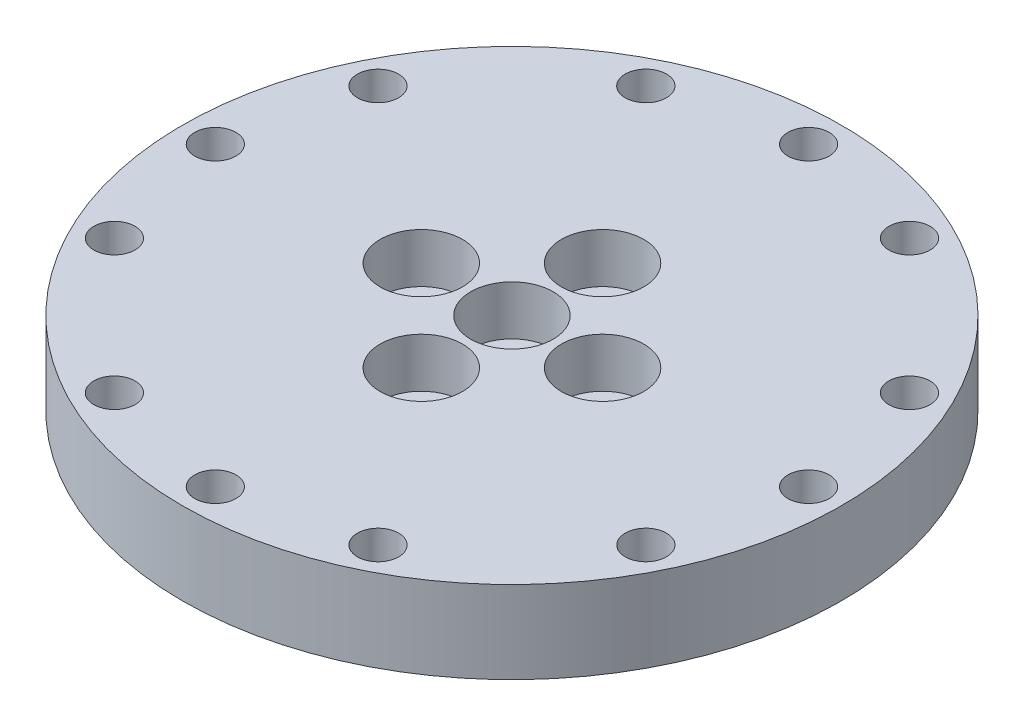
ISO-10303-21;
HEADER;
FILE_DESCRIPTION(('STEP AP214'),'2;1');
FILE_NAME('part.step','',(''),(''),'','','');
FILE_SCHEMA(('AUTOMOTIVE_DESIGN { 1 0 10303 214 1 1 1 1 }'));
ENDSEC;
DATA;
#1=APPLICATION_CONTEXT('core data for automotive mechanical design processes');
#2=APPLICATION_PROTOCOL_DEFINITION('international standard','automotive_design',2000,#1);
#3=PRODUCT_CONTEXT('',#1,'mechanical');
#4=PRODUCT('Part','Part','',(#3));
#5=PRODUCT_RELATED_PRODUCT_CATEGORY('part','',(#4));
#6=PRODUCT_DEFINITION_FORMATION('','',#4);
#7=PRODUCT_DEFINITION_CONTEXT('part definition',#1,'design');
#8=PRODUCT_DEFINITION('design','',#6,#7);
#9=PRODUCT_DEFINITION_SHAPE('','',#8);
#10=(LENGTH_UNIT() NAMED_UNIT(*) SI_UNIT(.MILLI.,.METRE.));
#11=(NAMED_UNIT(*) PLANE_ANGLE_UNIT() SI_UNIT($,.RADIAN.));
#12=(NAMED_UNIT(*) SI_UNIT($,.STERADIAN.) SOLID_ANGLE_UNIT());
#13=UNCERTAINTY_MEASURE_WITH_UNIT(LENGTH_MEASURE(1.E-05),#10,'distance_accuracy_value','');
#14=(GEOMETRIC_REPRESENTATION_CONTEXT(3) GLOBAL_UNCERTAINTY_ASSIGNED_CONTEXT((#13)) GLOBAL_UNIT_ASSIGNED_CONTEXT((#10,
#11,#12)) REPRESENTATION_CONTEXT('',''));
#15=CARTESIAN_POINT('',(0.,0.,0.));
#16=DIRECTION('',(0.,0.,1.));
#17=DIRECTION('',(1.,0.,0.));
#18=AXIS2_PLACEMENT_3D('',#15,#16,#17);
#19=CARTESIAN_POINT('',(0.,19.,0.));
#20=DIRECTION('',(0.,-1.,0.));
#21=DIRECTION('',(0.,0.,-1.));
#22=AXIS2_PLACEMENT_3D('',#19,#20,#21);
#23=CYLINDRICAL_SURFACE('',#22,3.05);
#24=CARTESIAN_POINT('',(0.,9.,0.));
#25=DIRECTION('',(0.,1.,0.));
#26=DIRECTION('',(0.,0.,1.));
#27=AXIS2_PLACEMENT_3D('',#24,#25,#26);
#28=CIRCLE('',#27,3.05);
#29=CARTESIAN_POINT('',(0.,9.,3.05));
#30=VERTEX_POINT('',#29);
#31=EDGE_CURVE('E62',#30,#30,#28,.T.);
#32=ORIENTED_EDGE('',*,*,#31,.F.);
#33=EDGE_LOOP('',(#32));
#34=FACE_BOUND('',#33,.T.);
#35=CARTESIAN_POINT('',(0.,13.,0.));
#36=DIRECTION('',(0.,1.,0.));
#37=DIRECTION('',(0.,0.,1.));
#38=AXIS2_PLACEMENT_3D('',#35,#36,#37);
#39=CIRCLE('',#38,3.05);
#40=CARTESIAN_POINT('',(0.,13.,3.05));
#41=VERTEX_POINT('',#40);
#42=EDGE_CURVE('E152',#41,#41,#39,.F.);
#43=ORIENTED_EDGE('',*,*,#42,.F.);
#44=EDGE_LOOP('',(#43));
#45=FACE_BOUND('',#44,.T.);
#46=ADVANCED_FACE('F39',(#34,#45),#23,.F.);
#47=CARTESIAN_POINT('',(-11.,19.,0.));
#48=DIRECTION('',(0.,-1.,0.));
#49=DIRECTION('',(0.,0.,-1.));
#50=AXIS2_PLACEMENT_3D('',#47,#48,#49);
#51=CYLINDRICAL_SURFACE('',#50,3.05);
#52=CARTESIAN_POINT('',(-11.,9.,0.));
#53=DIRECTION('',(0.,1.,0.));
#54=DIRECTION('',(0.,0.,1.));
#55=AXIS2_PLACEMENT_3D('',#52,#53,#54);
#56=CIRCLE('',#55,3.05);
#57=CARTESIAN_POINT('',(-11.,9.,3.05));
#58=VERTEX_POINT('',#57);
#59=EDGE_CURVE('E68',#58,#58,#56,.T.);
#60=ORIENTED_EDGE('',*,*,#59,.F.);
#61=EDGE_LOOP('',(#60));
#62=FACE_BOUND('',#61,.T.);
#63=CARTESIAN_POINT('',(-11.,13.,0.));
#64=DIRECTION('',(0.,1.,0.));
#65=DIRECTION('',(0.,0.,1.));
#66=AXIS2_PLACEMENT_3D('',#63,#64,#65);
#67=CIRCLE('',#66,3.05);
#68=CARTESIAN_POINT('',(-11.,13.,3.05));
#69=VERTEX_POINT('',#68);
#70=EDGE_CURVE('E163',#69,#69,#67,.F.);
#71=ORIENTED_EDGE('',*,*,#70,.F.);
#72=EDGE_LOOP('',(#71));
#73=FACE_BOUND('',#72,.T.);
#74=ADVANCED_FACE('F220',(#62,#73),#51,.F.);
#75=CARTESIAN_POINT('',(0.,19.,11.));
#76=DIRECTION('',(0.,-1.,0.));
#77=DIRECTION('',(0.,0.,-1.));
#78=AXIS2_PLACEMENT_3D('',#75,#76,#77);
#79=CYLINDRICAL_SURFACE('',#78,3.05);
#80=CARTESIAN_POINT('',(0.,9.,11.));
#81=DIRECTION('',(0.,1.,0.));
#82=DIRECTION('',(0.,0.,1.));
#83=AXIS2_PLACEMENT_3D('',#80,#81,#82);
#84=CIRCLE('',#83,3.05);
#85=CARTESIAN_POINT('',(0.,9.,14.05));
#86=VERTEX_POINT('',#85);
#87=EDGE_CURVE('E69',#86,#86,#84,.T.);
#88=ORIENTED_EDGE('',*,*,#87,.F.);
#89=EDGE_LOOP('',(#88));
#90=FACE_BOUND('',#89,.T.);
#91=CARTESIAN_POINT('',(0.,13.,11.));
#92=DIRECTION('',(0.,1.,0.));
#93=DIRECTION('',(0.,0.,1.));
#94=AXIS2_PLACEMENT_3D('',#91,#92,#93);
#95=CIRCLE('',#94,3.05);
#96=CARTESIAN_POINT('',(0.,13.,14.05));
#97=VERTEX_POINT('',#96);
#98=EDGE_CURVE('E171',#97,#97,#95,.F.);
#99=ORIENTED_EDGE('',*,*,#98,.F.);
#100=EDGE_LOOP('',(#99));
#101=FACE_BOUND('',#100,.T.);
#102=ADVANCED_FACE('F211',(#90,#101),#79,.F.);
#103=CARTESIAN_POINT('',(11.,19.,0.));
#104=DIRECTION('',(0.,-1.,0.));
#105=DIRECTION('',(0.,0.,-1.));
#106=AXIS2_PLACEMENT_3D('',#103,#104,#105);
#107=CYLINDRICAL_SURFACE('',#106,3.05);
#108=CARTESIAN_POINT('',(11.,9.,0.));
#109=DIRECTION('',(0.,1.,0.));
#110=DIRECTION('',(0.,0.,1.));
#111=AXIS2_PLACEMENT_3D('',#108,#109,#110);
#112=CIRCLE('',#111,3.05);
#113=CARTESIAN_POINT('',(11.,9.,3.05));
#114=VERTEX_POINT('',#113);
#115=EDGE_CURVE('E75',#114,#114,#112,.T.);
#116=ORIENTED_EDGE('',*,*,#115,.F.);
#117=EDGE_LOOP('',(#116));
#118=FACE_BOUND('',#117,.T.);
#119=CARTESIAN_POINT('',(11.,13.,0.));
#120=DIRECTION('',(0.,1.,0.));
#121=DIRECTION('',(0.,0.,1.));
#122=AXIS2_PLACEMENT_3D('',#119,#120,#121);
#123=CIRCLE('',#122,3.05);
#124=CARTESIAN_POINT('',(11.,13.,3.05));
#125=VERTEX_POINT('',#124);
#126=EDGE_CURVE('E181',#125,#125,#123,.F.);
#127=ORIENTED_EDGE('',*,*,#126,.F.);
#128=EDGE_LOOP('',(#127));
#129=FACE_BOUND('',#128,.T.);
#130=ADVANCED_FACE('F205',(#118,#129),#107,.F.);
#131=CARTESIAN_POINT('',(0.,19.,-11.));
#132=DIRECTION('',(0.,-1.,0.));
#133=DIRECTION('',(0.,0.,-1.));
#134=AXIS2_PLACEMENT_3D('',#131,#132,#133);
#135=CYLINDRICAL_SURFACE('',#134,3.05);
#136=CARTESIAN_POINT('',(0.,9.,-11.));
#137=DIRECTION('',(0.,1.,0.));
#138=DIRECTION('',(0.,0.,1.));
#139=AXIS2_PLACEMENT_3D('',#136,#137,#138);
#140=CIRCLE('',#139,3.05);
#141=CARTESIAN_POINT('',(0.,9.,-7.95));
#142=VERTEX_POINT('',#141);
#143=EDGE_CURVE('E73',#142,#142,#140,.T.);
#144=ORIENTED_EDGE('',*,*,#143,.F.);
#145=EDGE_LOOP('',(#144));
#146=FACE_BOUND('',#145,.T.);
#147=CARTESIAN_POINT('',(0.,13.,-11.));
#148=DIRECTION('',(0.,1.,0.));
#149=DIRECTION('',(0.,0.,1.));
#150=AXIS2_PLACEMENT_3D('',#147,#148,#149);
#151=CIRCLE('',#150,3.05);
#152=CARTESIAN_POINT('',(0.,13.,-7.95));
#153=VERTEX_POINT('',#152);
#154=EDGE_CURVE('E188',#153,#153,#151,.F.);
#155=ORIENTED_EDGE('',*,*,#154,.F.);
#156=EDGE_LOOP('',(#155));
#157=FACE_BOUND('',#156,.T.);
#158=ADVANCED_FACE('F200',(#146,#157),#135,.F.);
#159=CARTESIAN_POINT('',(0.,0.,0.));
#160=DIRECTION('',(0.,1.,0.));
#161=DIRECTION('',(0.,0.,1.));
#162=AXIS2_PLACEMENT_3D('',#159,#160,#161);
#163=PLANE('',#162);
#164=CARTESIAN_POINT('',(0.,0.,0.));
#165=DIRECTION('',(0.,1.,0.));
#166=DIRECTION('',(0.,0.,1.));
#167=AXIS2_PLACEMENT_3D('',#164,#165,#166);
#168=CIRCLE('',#167,21.5);
#169=CARTESIAN_POINT('',(0.,0.,21.5));
#170=VERTEX_POINT('',#169);
#171=EDGE_CURVE('E43',#170,#170,#168,.T.);
#172=ORIENTED_EDGE('',*,*,#171,.F.);
#173=EDGE_LOOP('',(#172));
#174=FACE_BOUND('',#173,.T.);
#175=CARTESIAN_POINT('',(0.,0.,0.));
#176=DIRECTION('',(0.,1.,0.));
#177=DIRECTION('',(0.,0.,1.));
#178=AXIS2_PLACEMENT_3D('',#175,#176,#177);
#179=CIRCLE('',#178,17.5);
#180=CARTESIAN_POINT('',(0.,0.,17.5));
#181=VERTEX_POINT('',#180);
#182=EDGE_CURVE('E49',#181,#181,#179,.T.);
#183=ORIENTED_EDGE('',*,*,#182,.T.);
#184=EDGE_LOOP('',(#183));
#185=FACE_BOUND('',#184,.T.);
#186=ADVANCED_FACE('F203',(#174,#185),#163,.F.);
#187=CARTESIAN_POINT('',(0.,9.,0.));
#188=DIRECTION('',(0.,-1.,0.));
#189=DIRECTION('',(0.,0.,-1.));
#190=AXIS2_PLACEMENT_3D('',#187,#188,#189);
#191=CYLINDRICAL_SURFACE('',#190,21.5);
#192=CARTESIAN_POINT('',(0.,9.,0.));
#193=DIRECTION('',(0.,1.,0.));
#194=DIRECTION('',(0.,0.,1.));
#195=AXIS2_PLACEMENT_3D('',#192,#193,#194);
#196=CIRCLE('',#195,21.5);
#197=CARTESIAN_POINT('',(0.,9.,21.5));
#198=VERTEX_POINT('',#197);
#199=EDGE_CURVE('E10',#198,#198,#196,.T.);
#200=ORIENTED_EDGE('',*,*,#199,.F.);
#201=EDGE_LOOP('',(#200));
#202=FACE_BOUND('',#201,.T.);
#203=ORIENTED_EDGE('',*,*,#171,.T.);
#204=EDGE_LOOP('',(#203));
#205=FACE_BOUND('',#204,.T.);
#206=ADVANCED_FACE('F41',(#202,#205),#191,.T.);
#207=CARTESIAN_POINT('',(0.,9.,0.));
#208=DIRECTION('',(0.,-1.,0.));
#209=DIRECTION('',(0.,0.,-1.));
#210=AXIS2_PLACEMENT_3D('',#207,#208,#209);
#211=CYLINDRICAL_SURFACE('',#210,17.5);
#212=CARTESIAN_POINT('',(0.,9.,0.));
#213=DIRECTION('',(0.,1.,0.));
#214=DIRECTION('',(0.,0.,1.));
#215=AXIS2_PLACEMENT_3D('',#212,#213,#214);
#216=CIRCLE('',#215,17.5);
#217=CARTESIAN_POINT('',(0.,9.,17.5));
#218=VERTEX_POINT('',#217);
#219=EDGE_CURVE('E53',#218,#218,#216,.T.);
#220=ORIENTED_EDGE('',*,*,#219,.T.);
#221=EDGE_LOOP('',(#220));
#222=FACE_BOUND('',#221,.T.);
#223=ORIENTED_EDGE('',*,*,#182,.F.);
#224=EDGE_LOOP('',(#223));
#225=FACE_BOUND('',#224,.T.);
#226=ADVANCED_FACE('F244',(#222,#225),#211,.F.);
#227=CARTESIAN_POINT('',(0.,9.,0.));
#228=DIRECTION('',(0.,1.,0.));
#229=DIRECTION('',(0.,0.,1.));
#230=AXIS2_PLACEMENT_3D('',#227,#228,#229);
#231=PLANE('',#230);
#232=ORIENTED_EDGE('',*,*,#143,.T.);
#233=EDGE_LOOP('',(#232));
#234=FACE_BOUND('',#233,.T.);
#235=ORIENTED_EDGE('',*,*,#115,.T.);
#236=EDGE_LOOP('',(#235));
#237=FACE_BOUND('',#236,.T.);
#238=ORIENTED_EDGE('',*,*,#87,.T.);
#239=EDGE_LOOP('',(#238));
#240=FACE_BOUND('',#239,.T.);
#241=ORIENTED_EDGE('',*,*,#59,.T.);
#242=EDGE_LOOP('',(#241));
#243=FACE_BOUND('',#242,.T.);
#244=ORIENTED_EDGE('',*,*,#31,.T.);
#245=EDGE_LOOP('',(#244));
#246=FACE_BOUND('',#245,.T.);
#247=ORIENTED_EDGE('',*,*,#219,.F.);
#248=EDGE_LOOP('',(#247));
#249=FACE_BOUND('',#248,.T.);
#250=ADVANCED_FACE('F231',(#234,#237,#240,#243,#246,#249),#231,.F.);
#251=CARTESIAN_POINT('',(0.,19.,0.));
#252=DIRECTION('',(0.,1.,0.));
#253=DIRECTION('',(0.,0.,1.));
#254=AXIS2_PLACEMENT_3D('',#251,#252,#253);
#255=PLANE('',#254);
#256=CARTESIAN_POINT('',(0.,19.,-11.));
#257=DIRECTION('',(0.,1.,0.));
#258=DIRECTION('',(0.,0.,1.));
#259=AXIS2_PLACEMENT_3D('',#256,#257,#258);
#260=CIRCLE('',#259,5.);
#261=CARTESIAN_POINT('',(0.,19.,-6.));
#262=VERTEX_POINT('',#261);
#263=EDGE_CURVE('E169',#262,#262,#260,.T.);
#264=ORIENTED_EDGE('',*,*,#263,.F.);
#265=EDGE_LOOP('',(#264));
#266=FACE_BOUND('',#265,.T.);
#267=CARTESIAN_POINT('',(0.,19.,11.));
#268=DIRECTION('',(0.,1.,0.));
#269=DIRECTION('',(0.,0.,1.));
#270=AXIS2_PLACEMENT_3D('',#267,#268,#269);
#271=CIRCLE('',#270,5.);
#272=CARTESIAN_POINT('',(0.,19.,16.));
#273=VERTEX_POINT('',#272);
#274=EDGE_CURVE('E172',#273,#273,#271,.T.);
#275=ORIENTED_EDGE('',*,*,#274,.F.);
#276=EDGE_LOOP('',(#275));
#277=FACE_BOUND('',#276,.T.);
#278=CARTESIAN_POINT('',(11.,19.,0.));
#279=DIRECTION('',(0.,1.,0.));
#280=DIRECTION('',(0.,0.,1.));
#281=AXIS2_PLACEMENT_3D('',#278,#279,#280);
#282=CIRCLE('',#281,5.);
#283=CARTESIAN_POINT('',(11.,19.,5.));
#284=VERTEX_POINT('',#283);
#285=EDGE_CURVE('E176',#284,#284,#282,.T.);
#286=ORIENTED_EDGE('',*,*,#285,.F.);
#287=EDGE_LOOP('',(#286));
#288=FACE_BOUND('',#287,.T.);
#289=CARTESIAN_POINT('',(0.,19.,0.));
#290=DIRECTION('',(0.,1.,0.));
#291=DIRECTION('',(0.,0.,1.));
#292=AXIS2_PLACEMENT_3D('',#289,#290,#291);
#293=CIRCLE('',#292,5.);
#294=CARTESIAN_POINT('',(0.,19.,5.));
#295=VERTEX_POINT('',#294);
#296=EDGE_CURVE('E151',#295,#295,#293,.T.);
#297=ORIENTED_EDGE('',*,*,#296,.F.);
#298=EDGE_LOOP('',(#297));
#299=FACE_BOUND('',#298,.T.);
#300=CARTESIAN_POINT('',(-11.,19.,0.));
#301=DIRECTION('',(0.,1.,0.));
#302=DIRECTION('',(0.,0.,1.));
#303=AXIS2_PLACEMENT_3D('',#300,#301,#302);
#304=CIRCLE('',#303,5.);
#305=CARTESIAN_POINT('',(-11.,19.,5.));
#306=VERTEX_POINT('',#305);
#307=EDGE_CURVE('E157',#306,#306,#304,.T.);
#308=ORIENTED_EDGE('',*,*,#307,.F.);
#309=EDGE_LOOP('',(#308));
#310=FACE_BOUND('',#309,.T.);
#311=CARTESIAN_POINT('',(32.2510830549863,19.,-15.9958632708703));
#312=DIRECTION('',(0.,1.,0.));
#313=DIRECTION('',(0.,0.,1.));
#314=AXIS2_PLACEMENT_3D('',#311,#312,#313);
#315=CIRCLE('',#314,2.50283122182016);
#316=CARTESIAN_POINT('',(32.2510830549863,19.,-13.4930320490502));
#317=VERTEX_POINT('',#316);
#318=EDGE_CURVE('E138',#317,#317,#315,.T.);
#319=ORIENTED_EDGE('',*,*,#318,.F.);
#320=EDGE_LOOP('',(#319));
#321=FACE_BOUND('',#320,.T.);
#322=CARTESIAN_POINT('',(16.,19.,32.25));
#323=DIRECTION('',(0.,1.,0.));
#324=DIRECTION('',(0.,0.,1.));
#325=AXIS2_PLACEMENT_3D('',#322,#323,#324);
#326=CIRCLE('',#325,2.5);
#327=CARTESIAN_POINT('',(16.,19.,34.75));
#328=VERTEX_POINT('',#327);
#329=EDGE_CURVE('E124',#328,#328,#326,.T.);
#330=ORIENTED_EDGE('',*,*,#329,.F.);
#331=EDGE_LOOP('',(#330));
#332=FACE_BOUND('',#331,.T.);
#333=CARTESIAN_POINT('',(-32.2510830549863,19.,15.9958632708703));
#334=DIRECTION('',(0.,1.,0.));
#335=DIRECTION('',(0.,0.,1.));
#336=AXIS2_PLACEMENT_3D('',#333,#334,#335);
#337=CIRCLE('',#336,2.49952999559767);
#338=CARTESIAN_POINT('',(-32.2510830549863,19.,18.495393266468));
#339=VERTEX_POINT('',#338);
#340=EDGE_CURVE('E115',#339,#339,#337,.T.);
#341=ORIENTED_EDGE('',*,*,#340,.F.);
#342=EDGE_LOOP('',(#341));
#343=FACE_BOUND('',#342,.T.);
#344=CARTESIAN_POINT('',(-36.,19.,0.));
#345=DIRECTION('',(0.,1.,0.));
#346=DIRECTION('',(0.,0.,1.));
#347=AXIS2_PLACEMENT_3D('',#344,#345,#346);
#348=CIRCLE('',#347,2.5);
#349=CARTESIAN_POINT('',(-36.,19.,2.5));
#350=VERTEX_POINT('',#349);
#351=EDGE_CURVE('E99',#350,#350,#348,.T.);
#352=ORIENTED_EDGE('',*,*,#351,.F.);
#353=EDGE_LOOP('',(#352));
#354=FACE_BOUND('',#353,.T.);
#355=CARTESIAN_POINT('',(-16.,19.,-32.2535851567538));
#356=DIRECTION('',(0.,1.,0.));
#357=DIRECTION('',(0.,0.,1.));
#358=AXIS2_PLACEMENT_3D('',#355,#356,#357);
#359=CIRCLE('',#358,2.50358515675376);
#360=CARTESIAN_POINT('',(-16.,19.,-29.75));
#361=VERTEX_POINT('',#360);
#362=EDGE_CURVE('E86',#361,#361,#359,.T.);
#363=ORIENTED_EDGE('',*,*,#362,.F.);
#364=EDGE_LOOP('',(#363));
#365=FACE_BOUND('',#364,.T.);
#366=CARTESIAN_POINT('',(0.,19.,-36.));
#367=DIRECTION('',(0.,1.,0.));
#368=DIRECTION('',(0.,0.,1.));
#369=AXIS2_PLACEMENT_3D('',#366,#367,#368);
#370=CIRCLE('',#369,2.5);
#371=CARTESIAN_POINT('',(0.,19.,-33.5));
#372=VERTEX_POINT('',#371);
#373=EDGE_CURVE('E80',#372,#372,#370,.T.);
#374=ORIENTED_EDGE('',*,*,#373,.F.);
#375=EDGE_LOOP('',(#374));
#376=FACE_BOUND('',#375,.T.);
#377=CARTESIAN_POINT('',(0.,19.,0.));
#378=DIRECTION('',(0.,1.,0.));
#379=DIRECTION('',(0.,0.,1.));
#380=AXIS2_PLACEMENT_3D('',#377,#378,#379);
#381=CIRCLE('',#380,40.);
#382=CARTESIAN_POINT('',(0.,19.,40.));
#383=VERTEX_POINT('',#382);
#384=EDGE_CURVE('E60',#383,#383,#381,.T.);
#385=ORIENTED_EDGE('',*,*,#384,.T.);
#386=EDGE_LOOP('',(#385));
#387=FACE_BOUND('',#386,.T.);
#388=CARTESIAN_POINT('',(-16.,19.,32.25));
#389=DIRECTION('',(0.,1.,0.));
#390=DIRECTION('',(0.,0.,1.));
#391=AXIS2_PLACEMENT_3D('',#388,#389,#390);
#392=CIRCLE('',#391,2.5);
#393=CARTESIAN_POINT('',(-16.,19.,34.75));
#394=VERTEX_POINT('',#393);
#395=EDGE_CURVE('E85',#394,#394,#392,.T.);
#396=ORIENTED_EDGE('',*,*,#395,.F.);
#397=EDGE_LOOP('',(#396));
#398=FACE_BOUND('',#397,.T.);
#399=CARTESIAN_POINT('',(16.,19.,-32.2535851567538));
#400=DIRECTION('',(0.,1.,0.));
#401=DIRECTION('',(0.,0.,1.));
#402=AXIS2_PLACEMENT_3D('',#399,#400,#401);
#403=CIRCLE('',#402,2.50358515675376);
#404=CARTESIAN_POINT('',(16.,19.,-29.75));
#405=VERTEX_POINT('',#404);
#406=EDGE_CURVE('E94',#405,#405,#403,.T.);
#407=ORIENTED_EDGE('',*,*,#406,.F.);
#408=EDGE_LOOP('',(#407));
#409=FACE_BOUND('',#408,.T.);
#410=CARTESIAN_POINT('',(-32.2510830549863,19.,-15.9958632708703));
#411=DIRECTION('',(0.,1.,0.));
#412=DIRECTION('',(0.,0.,1.));
#413=AXIS2_PLACEMENT_3D('',#410,#411,#412);
#414=CIRCLE('',#413,2.49692504726813);
#415=CARTESIAN_POINT('',(-32.2510830549863,19.,-13.4989382236022));
#416=VERTEX_POINT('',#415);
#417=EDGE_CURVE('E106',#416,#416,#414,.T.);
#418=ORIENTED_EDGE('',*,*,#417,.F.);
#419=EDGE_LOOP('',(#418));
#420=FACE_BOUND('',#419,.T.);
#421=CARTESIAN_POINT('',(0.,19.,36.));
#422=DIRECTION('',(0.,1.,0.));
#423=DIRECTION('',(0.,0.,1.));
#424=AXIS2_PLACEMENT_3D('',#421,#422,#423);
#425=CIRCLE('',#424,2.5);
#426=CARTESIAN_POINT('',(0.,19.,38.5));
#427=VERTEX_POINT('',#426);
#428=EDGE_CURVE('E120',#427,#427,#425,.T.);
#429=ORIENTED_EDGE('',*,*,#428,.F.);
#430=EDGE_LOOP('',(#429));
#431=FACE_BOUND('',#430,.T.);
#432=CARTESIAN_POINT('',(36.,19.,0.));
#433=DIRECTION('',(0.,1.,0.));
#434=DIRECTION('',(0.,0.,1.));
#435=AXIS2_PLACEMENT_3D('',#432,#433,#434);
#436=CIRCLE('',#435,2.49999999999999);
#437=CARTESIAN_POINT('',(36.,19.,2.49999999999999));
#438=VERTEX_POINT('',#437);
#439=EDGE_CURVE('E128',#438,#438,#436,.T.);
#440=ORIENTED_EDGE('',*,*,#439,.F.);
#441=EDGE_LOOP('',(#440));
#442=FACE_BOUND('',#441,.T.);
#443=CARTESIAN_POINT('',(32.2510830549863,19.,15.9958632708703));
#444=DIRECTION('',(0.,1.,0.));
#445=DIRECTION('',(0.,0.,1.));
#446=AXIS2_PLACEMENT_3D('',#443,#444,#445);
#447=CIRCLE('',#446,2.5);
#448=CARTESIAN_POINT('',(32.2510830549863,19.,18.4958632708703));
#449=VERTEX_POINT('',#448);
#450=EDGE_CURVE('E142',#449,#449,#447,.T.);
#451=ORIENTED_EDGE('',*,*,#450,.F.);
#452=EDGE_LOOP('',(#451));
#453=FACE_BOUND('',#452,.T.);
#454=ADVANCED_FACE('F228',(#266,#277,#288,#299,#310,#321,#332,#343,#354,#365,#376,#387,#398,
#409,#420,#431,#442,#453),#255,.T.);
#455=ORIENTED_EDGE('',*,*,#199,.T.);
#456=EDGE_LOOP('',(#455));
#457=FACE_BOUND('',#456,.T.);
#458=CARTESIAN_POINT('',(0.,9.,0.));
#459=DIRECTION('',(0.,1.,0.));
#460=DIRECTION('',(0.,0.,1.));
#461=AXIS2_PLACEMENT_3D('',#458,#459,#460);
#462=CIRCLE('',#461,40.);
#463=CARTESIAN_POINT('',(0.,9.,40.));
#464=VERTEX_POINT('',#463);
#465=EDGE_CURVE('E59',#464,#464,#462,.T.);
#466=ORIENTED_EDGE('',*,*,#465,.F.);
#467=EDGE_LOOP('',(#466));
#468=FACE_BOUND('',#467,.T.);
#469=CARTESIAN_POINT('',(0.,9.,-36.));
#470=DIRECTION('',(0.,1.,0.));
#471=DIRECTION('',(0.,0.,1.));
#472=AXIS2_PLACEMENT_3D('',#469,#470,#471);
#473=CIRCLE('',#472,2.5);
#474=CARTESIAN_POINT('',(0.,9.,-33.5));
#475=VERTEX_POINT('',#474);
#476=EDGE_CURVE('E76',#475,#475,#473,.T.);
#477=ORIENTED_EDGE('',*,*,#476,.T.);
#478=EDGE_LOOP('',(#477));
#479=FACE_BOUND('',#478,.T.);
#480=CARTESIAN_POINT('',(-16.,9.,32.25));
#481=DIRECTION('',(0.,1.,0.));
#482=DIRECTION('',(0.,0.,1.));
#483=AXIS2_PLACEMENT_3D('',#480,#481,#482);
#484=CIRCLE('',#483,2.5);
#485=CARTESIAN_POINT('',(-16.,9.,34.75));
#486=VERTEX_POINT('',#485);
#487=EDGE_CURVE('E82',#486,#486,#484,.T.);
#488=ORIENTED_EDGE('',*,*,#487,.T.);
#489=EDGE_LOOP('',(#488));
#490=FACE_BOUND('',#489,.T.);
#491=CARTESIAN_POINT('',(-16.,9.,-32.2535851567538));
#492=DIRECTION('',(0.,1.,0.));
#493=DIRECTION('',(0.,0.,1.));
#494=AXIS2_PLACEMENT_3D('',#491,#492,#493);
#495=CIRCLE('',#494,2.50358515675376);
#496=CARTESIAN_POINT('',(-16.,9.,-29.75));
#497=VERTEX_POINT('',#496);
#498=EDGE_CURVE('E93',#497,#497,#495,.T.);
#499=ORIENTED_EDGE('',*,*,#498,.T.);
#500=EDGE_LOOP('',(#499));
#501=FACE_BOUND('',#500,.T.);
#502=CARTESIAN_POINT('',(16.,9.,-32.2535851567538));
#503=DIRECTION('',(0.,1.,0.));
#504=DIRECTION('',(0.,0.,1.));
#505=AXIS2_PLACEMENT_3D('',#502,#503,#504);
#506=CIRCLE('',#505,2.50358515675376);
#507=CARTESIAN_POINT('',(16.,9.,-29.75));
#508=VERTEX_POINT('',#507);
#509=EDGE_CURVE('E100',#508,#508,#506,.T.);
#510=ORIENTED_EDGE('',*,*,#509,.T.);
#511=EDGE_LOOP('',(#510));
#512=FACE_BOUND('',#511,.T.);
#513=CARTESIAN_POINT('',(-36.,9.,0.));
#514=DIRECTION('',(0.,1.,0.));
#515=DIRECTION('',(0.,0.,1.));
#516=AXIS2_PLACEMENT_3D('',#513,#514,#515);
#517=CIRCLE('',#516,2.5);
#518=CARTESIAN_POINT('',(-36.,9.,2.5));
#519=VERTEX_POINT('',#518);
#520=EDGE_CURVE('E103',#519,#519,#517,.T.);
#521=ORIENTED_EDGE('',*,*,#520,.T.);
#522=EDGE_LOOP('',(#521));
#523=FACE_BOUND('',#522,.T.);
#524=CARTESIAN_POINT('',(-32.2510830549863,9.,-15.9958632708703));
#525=DIRECTION('',(0.,1.,0.));
#526=DIRECTION('',(0.,0.,1.));
#527=AXIS2_PLACEMENT_3D('',#524,#525,#526);
#528=CIRCLE('',#527,2.49692504726813);
#529=CARTESIAN_POINT('',(-32.2510830549863,9.,-13.4989382236022));
#530=VERTEX_POINT('',#529);
#531=EDGE_CURVE('E108',#530,#530,#528,.T.);
#532=ORIENTED_EDGE('',*,*,#531,.T.);
#533=EDGE_LOOP('',(#532));
#534=FACE_BOUND('',#533,.T.);
#535=CARTESIAN_POINT('',(-32.2510830549863,9.,15.9958632708703));
#536=DIRECTION('',(0.,1.,0.));
#537=DIRECTION('',(0.,0.,1.));
#538=AXIS2_PLACEMENT_3D('',#535,#536,#537);
#539=CIRCLE('',#538,2.49952999559767);
#540=CARTESIAN_POINT('',(-32.2510830549863,9.,18.495393266468));
#541=VERTEX_POINT('',#540);
#542=EDGE_CURVE('E113',#541,#541,#539,.T.);
#543=ORIENTED_EDGE('',*,*,#542,.T.);
#544=EDGE_LOOP('',(#543));
#545=FACE_BOUND('',#544,.T.);
#546=CARTESIAN_POINT('',(0.,9.,36.));
#547=DIRECTION('',(0.,1.,0.));
#548=DIRECTION('',(0.,0.,1.));
#549=AXIS2_PLACEMENT_3D('',#546,#547,#548);
#550=CIRCLE('',#549,2.5);
#551=CARTESIAN_POINT('',(0.,9.,38.5));
#552=VERTEX_POINT('',#551);
#553=EDGE_CURVE('E123',#552,#552,#550,.T.);
#554=ORIENTED_EDGE('',*,*,#553,.T.);
#555=EDGE_LOOP('',(#554));
#556=FACE_BOUND('',#555,.T.);
#557=CARTESIAN_POINT('',(16.,9.,32.25));
#558=DIRECTION('',(0.,1.,0.));
#559=DIRECTION('',(0.,0.,1.));
#560=AXIS2_PLACEMENT_3D('',#557,#558,#559);
#561=CIRCLE('',#560,2.5);
#562=CARTESIAN_POINT('',(16.,9.,34.75));
#563=VERTEX_POINT('',#562);
#564=EDGE_CURVE('E130',#563,#563,#561,.T.);
#565=ORIENTED_EDGE('',*,*,#564,.T.);
#566=EDGE_LOOP('',(#565));
#567=FACE_BOUND('',#566,.T.);
#568=CARTESIAN_POINT('',(36.,9.,0.));
#569=DIRECTION('',(0.,1.,0.));
#570=DIRECTION('',(0.,0.,1.));
#571=AXIS2_PLACEMENT_3D('',#568,#569,#570);
#572=CIRCLE('',#571,2.49999999999999);
#573=CARTESIAN_POINT('',(36.,9.,2.49999999999999));
#574=VERTEX_POINT('',#573);
#575=EDGE_CURVE('E135',#574,#574,#572,.T.);
#576=ORIENTED_EDGE('',*,*,#575,.T.);
#577=EDGE_LOOP('',(#576));
#578=FACE_BOUND('',#577,.T.);
#579=CARTESIAN_POINT('',(32.2510830549863,9.,-15.9958632708703));
#580=DIRECTION('',(0.,1.,0.));
#581=DIRECTION('',(0.,0.,1.));
#582=AXIS2_PLACEMENT_3D('',#579,#580,#581);
#583=CIRCLE('',#582,2.50283122182016);
#584=CARTESIAN_POINT('',(32.2510830549863,9.,-13.4930320490502));
#585=VERTEX_POINT('',#584);
#586=EDGE_CURVE('E139',#585,#585,#583,.T.);
#587=ORIENTED_EDGE('',*,*,#586,.T.);
#588=EDGE_LOOP('',(#587));
#589=FACE_BOUND('',#588,.T.);
#590=CARTESIAN_POINT('',(32.2510830549863,9.,15.9958632708703));
#591=DIRECTION('',(0.,1.,0.));
#592=DIRECTION('',(0.,0.,1.));
#593=AXIS2_PLACEMENT_3D('',#590,#591,#592);
#594=CIRCLE('',#593,2.5);
#595=CARTESIAN_POINT('',(32.2510830549863,9.,18.4958632708703));
#596=VERTEX_POINT('',#595);
#597=EDGE_CURVE('E144',#596,#596,#594,.T.);
#598=ORIENTED_EDGE('',*,*,#597,.T.);
#599=EDGE_LOOP('',(#598));
#600=FACE_BOUND('',#599,.T.);
#601=ADVANCED_FACE('F235',(#457,#468,#479,#490,#501,#512,#523,#534,#545,#556,#567,#578,#589,
#600),#231,.F.);
#602=CARTESIAN_POINT('',(0.,19.,0.));
#603=DIRECTION('',(0.,-1.,0.));
#604=DIRECTION('',(0.,0.,-1.));
#605=AXIS2_PLACEMENT_3D('',#602,#603,#604);
#606=CYLINDRICAL_SURFACE('',#605,40.);
#607=ORIENTED_EDGE('',*,*,#384,.F.);
#608=EDGE_LOOP('',(#607));
#609=FACE_BOUND('',#608,.T.);
#610=ORIENTED_EDGE('',*,*,#465,.T.);
#611=EDGE_LOOP('',(#610));
#612=FACE_BOUND('',#611,.T.);
#613=ADVANCED_FACE('F240',(#609,#612),#606,.T.);
#614=CARTESIAN_POINT('',(0.,19.,-36.));
#615=DIRECTION('',(0.,-1.,0.));
#616=DIRECTION('',(0.,0.,-1.));
#617=AXIS2_PLACEMENT_3D('',#614,#615,#616);
#618=CYLINDRICAL_SURFACE('',#617,2.5);
#619=ORIENTED_EDGE('',*,*,#373,.T.);
#620=EDGE_LOOP('',(#619));
#621=FACE_BOUND('',#620,.T.);
#622=ORIENTED_EDGE('',*,*,#476,.F.);
#623=EDGE_LOOP('',(#622));
#624=FACE_BOUND('',#623,.T.);
#625=ADVANCED_FACE('F238',(#621,#624),#618,.F.);
#626=CARTESIAN_POINT('',(-16.,19.,32.25));
#627=DIRECTION('',(0.,-1.,0.));
#628=DIRECTION('',(0.,0.,-1.));
#629=AXIS2_PLACEMENT_3D('',#626,#627,#628);
#630=CYLINDRICAL_SURFACE('',#629,2.5);
#631=ORIENTED_EDGE('',*,*,#395,.T.);
#632=EDGE_LOOP('',(#631));
#633=FACE_BOUND('',#632,.T.);
#634=ORIENTED_EDGE('',*,*,#487,.F.);
#635=EDGE_LOOP('',(#634));
#636=FACE_BOUND('',#635,.T.);
#637=ADVANCED_FACE('F296',(#633,#636),#630,.F.);
#638=CARTESIAN_POINT('',(-16.,19.,-32.2535851567538));
#639=DIRECTION('',(0.,-1.,0.));
#640=DIRECTION('',(0.,0.,-1.));
#641=AXIS2_PLACEMENT_3D('',#638,#639,#640);
#642=CYLINDRICAL_SURFACE('',#641,2.50358515675376);
#643=ORIENTED_EDGE('',*,*,#362,.T.);
#644=EDGE_LOOP('',(#643));
#645=FACE_BOUND('',#644,.T.);
#646=ORIENTED_EDGE('',*,*,#498,.F.);
#647=EDGE_LOOP('',(#646));
#648=FACE_BOUND('',#647,.T.);
#649=ADVANCED_FACE('F307',(#645,#648),#642,.F.);
#650=CARTESIAN_POINT('',(16.,19.,-32.2535851567538));
#651=DIRECTION('',(0.,-1.,0.));
#652=DIRECTION('',(0.,0.,-1.));
#653=AXIS2_PLACEMENT_3D('',#650,#651,#652);
#654=CYLINDRICAL_SURFACE('',#653,2.50358515675376);
#655=ORIENTED_EDGE('',*,*,#406,.T.);
#656=EDGE_LOOP('',(#655));
#657=FACE_BOUND('',#656,.T.);
#658=ORIENTED_EDGE('',*,*,#509,.F.);
#659=EDGE_LOOP('',(#658));
#660=FACE_BOUND('',#659,.T.);
#661=ADVANCED_FACE('F316',(#657,#660),#654,.F.);
#662=CARTESIAN_POINT('',(-36.,19.,0.));
#663=DIRECTION('',(0.,-1.,0.));
#664=DIRECTION('',(0.,0.,-1.));
#665=AXIS2_PLACEMENT_3D('',#662,#663,#664);
#666=CYLINDRICAL_SURFACE('',#665,2.5);
#667=ORIENTED_EDGE('',*,*,#351,.T.);
#668=EDGE_LOOP('',(#667));
#669=FACE_BOUND('',#668,.T.);
#670=ORIENTED_EDGE('',*,*,#520,.F.);
#671=EDGE_LOOP('',(#670));
#672=FACE_BOUND('',#671,.T.);
#673=ADVANCED_FACE('F324',(#669,#672),#666,.F.);
#674=CARTESIAN_POINT('',(-32.2510830549863,19.,-15.9958632708703));
#675=DIRECTION('',(0.,-1.,0.));
#676=DIRECTION('',(0.,0.,-1.));
#677=AXIS2_PLACEMENT_3D('',#674,#675,#676);
#678=CYLINDRICAL_SURFACE('',#677,2.49692504726813);
#679=ORIENTED_EDGE('',*,*,#417,.T.);
#680=EDGE_LOOP('',(#679));
#681=FACE_BOUND('',#680,.T.);
#682=ORIENTED_EDGE('',*,*,#531,.F.);
#683=EDGE_LOOP('',(#682));
#684=FACE_BOUND('',#683,.T.);
#685=ADVANCED_FACE('F331',(#681,#684),#678,.F.);
#686=CARTESIAN_POINT('',(-32.2510830549863,19.,15.9958632708703));
#687=DIRECTION('',(0.,-1.,0.));
#688=DIRECTION('',(0.,0.,-1.));
#689=AXIS2_PLACEMENT_3D('',#686,#687,#688);
#690=CYLINDRICAL_SURFACE('',#689,2.49952999559767);
#691=ORIENTED_EDGE('',*,*,#340,.T.);
#692=EDGE_LOOP('',(#691));
#693=FACE_BOUND('',#692,.T.);
#694=ORIENTED_EDGE('',*,*,#542,.F.);
#695=EDGE_LOOP('',(#694));
#696=FACE_BOUND('',#695,.T.);
#697=ADVANCED_FACE('F341',(#693,#696),#690,.F.);
#698=CARTESIAN_POINT('',(0.,19.,36.));
#699=DIRECTION('',(0.,-1.,0.));
#700=DIRECTION('',(0.,0.,-1.));
#701=AXIS2_PLACEMENT_3D('',#698,#699,#700);
#702=CYLINDRICAL_SURFACE('',#701,2.5);
#703=ORIENTED_EDGE('',*,*,#428,.T.);
#704=EDGE_LOOP('',(#703));
#705=FACE_BOUND('',#704,.T.);
#706=ORIENTED_EDGE('',*,*,#553,.F.);
#707=EDGE_LOOP('',(#706));
#708=FACE_BOUND('',#707,.T.);
#709=ADVANCED_FACE('F354',(#705,#708),#702,.F.);
#710=CARTESIAN_POINT('',(16.,19.,32.25));
#711=DIRECTION('',(0.,-1.,0.));
#712=DIRECTION('',(0.,0.,-1.));
#713=AXIS2_PLACEMENT_3D('',#710,#711,#712);
#714=CYLINDRICAL_SURFACE('',#713,2.5);
#715=ORIENTED_EDGE('',*,*,#329,.T.);
#716=EDGE_LOOP('',(#715));
#717=FACE_BOUND('',#716,.T.);
#718=ORIENTED_EDGE('',*,*,#564,.F.);
#719=EDGE_LOOP('',(#718));
#720=FACE_BOUND('',#719,.T.);
#721=ADVANCED_FACE('F363',(#717,#720),#714,.F.);
#722=CARTESIAN_POINT('',(36.,19.,0.));
#723=DIRECTION('',(0.,-1.,0.));
#724=DIRECTION('',(0.,0.,-1.));
#725=AXIS2_PLACEMENT_3D('',#722,#723,#724);
#726=CYLINDRICAL_SURFACE('',#725,2.49999999999999);
#727=ORIENTED_EDGE('',*,*,#439,.T.);
#728=EDGE_LOOP('',(#727));
#729=FACE_BOUND('',#728,.T.);
#730=ORIENTED_EDGE('',*,*,#575,.F.);
#731=EDGE_LOOP('',(#730));
#732=FACE_BOUND('',#731,.T.);
#733=ADVANCED_FACE('F367',(#729,#732),#726,.F.);
#734=CARTESIAN_POINT('',(32.2510830549863,19.,-15.9958632708703));
#735=DIRECTION('',(0.,-1.,0.));
#736=DIRECTION('',(0.,0.,-1.));
#737=AXIS2_PLACEMENT_3D('',#734,#735,#736);
#738=CYLINDRICAL_SURFACE('',#737,2.50283122182016);
#739=ORIENTED_EDGE('',*,*,#318,.T.);
#740=EDGE_LOOP('',(#739));
#741=FACE_BOUND('',#740,.T.);
#742=ORIENTED_EDGE('',*,*,#586,.F.);
#743=EDGE_LOOP('',(#742));
#744=FACE_BOUND('',#743,.T.);
#745=ADVANCED_FACE('F377',(#741,#744),#738,.F.);
#746=CARTESIAN_POINT('',(32.2510830549863,19.,15.9958632708703));
#747=DIRECTION('',(0.,-1.,0.));
#748=DIRECTION('',(0.,0.,-1.));
#749=AXIS2_PLACEMENT_3D('',#746,#747,#748);
#750=CYLINDRICAL_SURFACE('',#749,2.5);
#751=ORIENTED_EDGE('',*,*,#450,.T.);
#752=EDGE_LOOP('',(#751));
#753=FACE_BOUND('',#752,.T.);
#754=ORIENTED_EDGE('',*,*,#597,.F.);
#755=EDGE_LOOP('',(#754));
#756=FACE_BOUND('',#755,.T.);
#757=ADVANCED_FACE('F389',(#753,#756),#750,.F.);
#758=CARTESIAN_POINT('',(0.,13.,-11.));
#759=DIRECTION('',(0.,1.,0.));
#760=DIRECTION('',(0.,0.,1.));
#761=AXIS2_PLACEMENT_3D('',#758,#759,#760);
#762=CYLINDRICAL_SURFACE('',#761,5.);
#763=CARTESIAN_POINT('',(0.,13.,-11.));
#764=DIRECTION('',(0.,1.,0.));
#765=DIRECTION('',(0.,0.,1.));
#766=AXIS2_PLACEMENT_3D('',#763,#764,#765);
#767=CIRCLE('',#766,5.);
#768=CARTESIAN_POINT('',(0.,13.,-6.));
#769=VERTEX_POINT('',#768);
#770=EDGE_CURVE('E146',#769,#769,#767,.T.);
#771=ORIENTED_EDGE('',*,*,#770,.F.);
#772=EDGE_LOOP('',(#771));
#773=FACE_BOUND('',#772,.T.);
#774=ORIENTED_EDGE('',*,*,#263,.T.);
#775=EDGE_LOOP('',(#774));
#776=FACE_BOUND('',#775,.T.);
#777=ADVANCED_FACE('F393',(#773,#776),#762,.F.);
#778=CARTESIAN_POINT('',(0.,13.,0.));
#779=DIRECTION('',(0.,1.,0.));
#780=DIRECTION('',(0.,0.,1.));
#781=AXIS2_PLACEMENT_3D('',#778,#779,#780);
#782=PLANE('',#781);
#783=ORIENTED_EDGE('',*,*,#154,.T.);
#784=EDGE_LOOP('',(#783));
#785=FACE_BOUND('',#784,.T.);
#786=ORIENTED_EDGE('',*,*,#770,.T.);
#787=EDGE_LOOP('',(#786));
#788=FACE_BOUND('',#787,.T.);
#789=ADVANCED_FACE('F198',(#785,#788),#782,.T.);
#790=CARTESIAN_POINT('',(11.,13.,0.));
#791=DIRECTION('',(0.,1.,0.));
#792=DIRECTION('',(0.,0.,1.));
#793=AXIS2_PLACEMENT_3D('',#790,#791,#792);
#794=CYLINDRICAL_SURFACE('',#793,5.);
#795=CARTESIAN_POINT('',(11.,13.,0.));
#796=DIRECTION('',(0.,1.,0.));
#797=DIRECTION('',(0.,0.,1.));
#798=AXIS2_PLACEMENT_3D('',#795,#796,#797);
#799=CIRCLE('',#798,5.);
#800=CARTESIAN_POINT('',(11.,13.,5.));
#801=VERTEX_POINT('',#800);
#802=EDGE_CURVE('E154',#801,#801,#799,.T.);
#803=ORIENTED_EDGE('',*,*,#802,.F.);
#804=EDGE_LOOP('',(#803));
#805=FACE_BOUND('',#804,.T.);
#806=ORIENTED_EDGE('',*,*,#285,.T.);
#807=EDGE_LOOP('',(#806));
#808=FACE_BOUND('',#807,.T.);
#809=ADVANCED_FACE('F442',(#805,#808),#794,.F.);
#810=CARTESIAN_POINT('',(0.,13.,0.));
#811=DIRECTION('',(0.,1.,0.));
#812=DIRECTION('',(0.,0.,1.));
#813=AXIS2_PLACEMENT_3D('',#810,#811,#812);
#814=PLANE('',#813);
#815=ORIENTED_EDGE('',*,*,#126,.T.);
#816=EDGE_LOOP('',(#815));
#817=FACE_BOUND('',#816,.T.);
#818=ORIENTED_EDGE('',*,*,#802,.T.);
#819=EDGE_LOOP('',(#818));
#820=FACE_BOUND('',#819,.T.);
#821=ADVANCED_FACE('F446',(#817,#820),#814,.T.);
#822=CARTESIAN_POINT('',(0.,13.,11.));
#823=DIRECTION('',(0.,1.,0.));
#824=DIRECTION('',(0.,0.,1.));
#825=AXIS2_PLACEMENT_3D('',#822,#823,#824);
#826=CYLINDRICAL_SURFACE('',#825,5.);
#827=CARTESIAN_POINT('',(0.,13.,11.));
#828=DIRECTION('',(0.,1.,0.));
#829=DIRECTION('',(0.,0.,1.));
#830=AXIS2_PLACEMENT_3D('',#827,#828,#829);
#831=CIRCLE('',#830,5.);
#832=CARTESIAN_POINT('',(0.,13.,16.));
#833=VERTEX_POINT('',#832);
#834=EDGE_CURVE('E173',#833,#833,#831,.T.);
#835=ORIENTED_EDGE('',*,*,#834,.F.);
#836=EDGE_LOOP('',(#835));
#837=FACE_BOUND('',#836,.T.);
#838=ORIENTED_EDGE('',*,*,#274,.T.);
#839=EDGE_LOOP('',(#838));
#840=FACE_BOUND('',#839,.T.);
#841=ADVANCED_FACE('F456',(#837,#840),#826,.F.);
#842=CARTESIAN_POINT('',(0.,13.,0.));
#843=DIRECTION('',(0.,1.,0.));
#844=DIRECTION('',(0.,0.,1.));
#845=AXIS2_PLACEMENT_3D('',#842,#843,#844);
#846=PLANE('',#845);
#847=ORIENTED_EDGE('',*,*,#98,.T.);
#848=EDGE_LOOP('',(#847));
#849=FACE_BOUND('',#848,.T.);
#850=ORIENTED_EDGE('',*,*,#834,.T.);
#851=EDGE_LOOP('',(#850));
#852=FACE_BOUND('',#851,.T.);
#853=ADVANCED_FACE('F470',(#849,#852),#846,.T.);
#854=CARTESIAN_POINT('',(-11.,13.,0.));
#855=DIRECTION('',(0.,1.,0.));
#856=DIRECTION('',(0.,0.,1.));
#857=AXIS2_PLACEMENT_3D('',#854,#855,#856);
#858=CYLINDRICAL_SURFACE('',#857,5.);
#859=CARTESIAN_POINT('',(-11.,13.,0.));
#860=DIRECTION('',(0.,1.,0.));
#861=DIRECTION('',(0.,0.,1.));
#862=AXIS2_PLACEMENT_3D('',#859,#860,#861);
#863=CIRCLE('',#862,5.);
#864=CARTESIAN_POINT('',(-11.,13.,5.));
#865=VERTEX_POINT('',#864);
#866=EDGE_CURVE('E164',#865,#865,#863,.T.);
#867=ORIENTED_EDGE('',*,*,#866,.F.);
#868=EDGE_LOOP('',(#867));
#869=FACE_BOUND('',#868,.T.);
#870=ORIENTED_EDGE('',*,*,#307,.T.);
#871=EDGE_LOOP('',(#870));
#872=FACE_BOUND('',#871,.T.);
#873=ADVANCED_FACE('F478',(#869,#872),#858,.F.);
#874=CARTESIAN_POINT('',(0.,13.,0.));
#875=DIRECTION('',(0.,1.,0.));
#876=DIRECTION('',(0.,0.,1.));
#877=AXIS2_PLACEMENT_3D('',#874,#875,#876);
#878=PLANE('',#877);
#879=ORIENTED_EDGE('',*,*,#70,.T.);
#880=EDGE_LOOP('',(#879));
#881=FACE_BOUND('',#880,.T.);
#882=ORIENTED_EDGE('',*,*,#866,.T.);
#883=EDGE_LOOP('',(#882));
#884=FACE_BOUND('',#883,.T.);
#885=ADVANCED_FACE('F484',(#881,#884),#878,.T.);
#886=CARTESIAN_POINT('',(0.,13.,0.));
#887=DIRECTION('',(0.,1.,0.));
#888=DIRECTION('',(0.,0.,1.));
#889=AXIS2_PLACEMENT_3D('',#886,#887,#888);
#890=CYLINDRICAL_SURFACE('',#889,5.);
#891=CARTESIAN_POINT('',(0.,13.,0.));
#892=DIRECTION('',(0.,1.,0.));
#893=DIRECTION('',(0.,0.,1.));
#894=AXIS2_PLACEMENT_3D('',#891,#892,#893);
#895=CIRCLE('',#894,5.);
#896=CARTESIAN_POINT('',(0.,13.,5.));
#897=VERTEX_POINT('',#896);
#898=EDGE_CURVE('E156',#897,#897,#895,.T.);
#899=ORIENTED_EDGE('',*,*,#898,.F.);
#900=EDGE_LOOP('',(#899));
#901=FACE_BOUND('',#900,.T.);
#902=ORIENTED_EDGE('',*,*,#296,.T.);
#903=EDGE_LOOP('',(#902));
#904=FACE_BOUND('',#903,.T.);
#905=ADVANCED_FACE('F493',(#901,#904),#890,.F.);
#906=CARTESIAN_POINT('',(0.,13.,0.));
#907=DIRECTION('',(0.,1.,0.));
#908=DIRECTION('',(0.,0.,1.));
#909=AXIS2_PLACEMENT_3D('',#906,#907,#908);
#910=PLANE('',#909);
#911=ORIENTED_EDGE('',*,*,#42,.T.);
#912=EDGE_LOOP('',(#911));
#913=FACE_BOUND('',#912,.T.);
#914=ORIENTED_EDGE('',*,*,#898,.T.);
#915=EDGE_LOOP('',(#914));
#916=FACE_BOUND('',#915,.T.);
#917=ADVANCED_FACE('F505',(#913,#916),#910,.T.);
#918=CLOSED_SHELL('',(#46,#74,#102,#130,#158,#186,#206,#226,#250,#454,#601,#613,#625,#637,#649,
#661,#673,#685,#697,#709,#721,#733,#745,#757,#777,#789,#809,#821,#841,#853,#873,#885,#905,#917));
#919=MANIFOLD_SOLID_BREP('B2',#918);
#920=ADVANCED_BREP_SHAPE_REPRESENTATION('',(#18,#919),#14);
#921=SHAPE_DEFINITION_REPRESENTATION(#9,#920);
ENDSEC;
END-ISO-10303-21;
